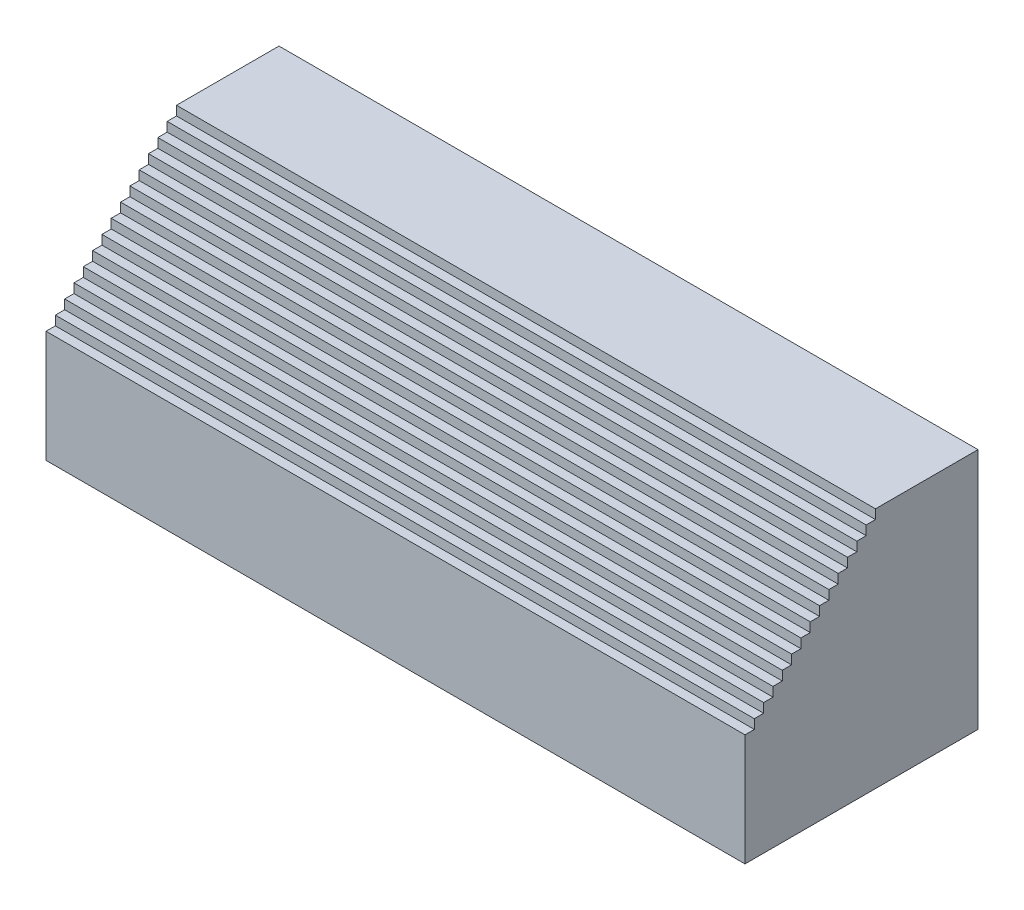
ISO-10303-21;
HEADER;
FILE_DESCRIPTION(('STEP AP214'),'2;1');
FILE_NAME('part.step','',(''),(''),'','','');
FILE_SCHEMA(('AUTOMOTIVE_DESIGN { 1 0 10303 214 1 1 1 1 }'));
ENDSEC;
DATA;
#1=APPLICATION_CONTEXT('core data for automotive mechanical design processes');
#2=APPLICATION_PROTOCOL_DEFINITION('international standard','automotive_design',2000,#1);
#3=PRODUCT_CONTEXT('',#1,'mechanical');
#4=PRODUCT('Part','Part','',(#3));
#5=PRODUCT_RELATED_PRODUCT_CATEGORY('part','',(#4));
#6=PRODUCT_DEFINITION_FORMATION('','',#4);
#7=PRODUCT_DEFINITION_CONTEXT('part definition',#1,'design');
#8=PRODUCT_DEFINITION('design','',#6,#7);
#9=PRODUCT_DEFINITION_SHAPE('','',#8);
#10=(LENGTH_UNIT() NAMED_UNIT(*) SI_UNIT(.MILLI.,.METRE.));
#11=(NAMED_UNIT(*) PLANE_ANGLE_UNIT() SI_UNIT($,.RADIAN.));
#12=(NAMED_UNIT(*) SI_UNIT($,.STERADIAN.) SOLID_ANGLE_UNIT());
#13=UNCERTAINTY_MEASURE_WITH_UNIT(LENGTH_MEASURE(1.E-05),#10,'distance_accuracy_value','');
#14=(GEOMETRIC_REPRESENTATION_CONTEXT(3) GLOBAL_UNCERTAINTY_ASSIGNED_CONTEXT((#13)) GLOBAL_UNIT_ASSIGNED_CONTEXT((#10,
#11,#12)) REPRESENTATION_CONTEXT('',''));
#15=CARTESIAN_POINT('',(0.,0.,0.));
#16=DIRECTION('',(0.,0.,1.));
#17=DIRECTION('',(1.,0.,0.));
#18=AXIS2_PLACEMENT_3D('',#15,#16,#17);
#19=CARTESIAN_POINT('',(-7.5,5.2,-2.5));
#20=DIRECTION('',(1.,0.,0.));
#21=DIRECTION('',(0.,0.,-1.));
#22=AXIS2_PLACEMENT_3D('',#19,#20,#21);
#23=PLANE('',#22);
#24=DIRECTION('',(0.,0.,-1.));
#25=VECTOR('',#24,1.);
#26=CARTESIAN_POINT('',(-7.5,5.,-0.100331192697603));
#27=LINE('',#26,#25);
#28=CARTESIAN_POINT('',(-7.5,5.,-0.100331192697603));
#29=VERTEX_POINT('',#28);
#30=CARTESIAN_POINT('',(-7.5,5.,-0.300331192697603));
#31=VERTEX_POINT('',#30);
#32=EDGE_CURVE('E300',#29,#31,#27,.T.);
#33=ORIENTED_EDGE('',*,*,#32,.T.);
#34=DIRECTION('',(0.,1.,0.));
#35=VECTOR('',#34,1.);
#36=CARTESIAN_POINT('',(-7.5,5.,-0.300331192697603));
#37=LINE('',#36,#35);
#38=CARTESIAN_POINT('',(-7.5,5.2,-0.300331192697603));
#39=VERTEX_POINT('',#38);
#40=EDGE_CURVE('E368',#31,#39,#37,.T.);
#41=ORIENTED_EDGE('',*,*,#40,.T.);
#42=DIRECTION('',(0.,0.,1.));
#43=VECTOR('',#42,1.);
#44=CARTESIAN_POINT('',(-7.5,5.2,-2.5));
#45=LINE('',#44,#43);
#46=CARTESIAN_POINT('',(-7.5,5.2,-2.5));
#47=VERTEX_POINT('',#46);
#48=EDGE_CURVE('E86',#47,#39,#45,.T.);
#49=ORIENTED_EDGE('',*,*,#48,.F.);
#50=DIRECTION('',(0.,-1.,0.));
#51=VECTOR('',#50,1.);
#52=CARTESIAN_POINT('',(-7.5,5.2,-2.5));
#53=LINE('',#52,#51);
#54=CARTESIAN_POINT('',(-7.5,0.,-2.5));
#55=VERTEX_POINT('',#54);
#56=EDGE_CURVE('E79',#47,#55,#53,.T.);
#57=ORIENTED_EDGE('',*,*,#56,.T.);
#58=DIRECTION('',(0.,0.,1.));
#59=VECTOR('',#58,1.);
#60=CARTESIAN_POINT('',(-7.5,0.,-2.5));
#61=LINE('',#60,#59);
#62=CARTESIAN_POINT('',(-7.5,0.,2.5));
#63=VERTEX_POINT('',#62);
#64=EDGE_CURVE('E93',#55,#63,#61,.T.);
#65=ORIENTED_EDGE('',*,*,#64,.T.);
#66=DIRECTION('',(0.,-1.,0.));
#67=VECTOR('',#66,1.);
#68=CARTESIAN_POINT('',(-7.5,5.2,2.5));
#69=LINE('',#68,#67);
#70=CARTESIAN_POINT('',(-7.5,2.4,2.5));
#71=VERTEX_POINT('',#70);
#72=EDGE_CURVE('E11',#71,#63,#69,.T.);
#73=ORIENTED_EDGE('',*,*,#72,.F.);
#74=DIRECTION('',(0.,0.,-1.));
#75=VECTOR('',#74,1.);
#76=CARTESIAN_POINT('',(-7.5,2.4,2.5));
#77=LINE('',#76,#75);
#78=CARTESIAN_POINT('',(-7.5,2.4,2.3));
#79=VERTEX_POINT('',#78);
#80=EDGE_CURVE('E128',#71,#79,#77,.T.);
#81=ORIENTED_EDGE('',*,*,#80,.T.);
#82=DIRECTION('',(0.,1.,0.));
#83=VECTOR('',#82,1.);
#84=CARTESIAN_POINT('',(-7.5,2.4,2.3));
#85=LINE('',#84,#83);
#86=CARTESIAN_POINT('',(-7.5,2.6,2.3));
#87=VERTEX_POINT('',#86);
#88=EDGE_CURVE('E578',#79,#87,#85,.T.);
#89=ORIENTED_EDGE('',*,*,#88,.T.);
#90=DIRECTION('',(0.,0.,-1.));
#91=VECTOR('',#90,1.);
#92=CARTESIAN_POINT('',(-7.5,2.6,2.3));
#93=LINE('',#92,#91);
#94=CARTESIAN_POINT('',(-7.5,2.6,2.1));
#95=VERTEX_POINT('',#94);
#96=EDGE_CURVE('E574',#87,#95,#93,.T.);
#97=ORIENTED_EDGE('',*,*,#96,.T.);
#98=DIRECTION('',(0.,1.,0.));
#99=VECTOR('',#98,1.);
#100=CARTESIAN_POINT('',(-7.5,2.6,2.1));
#101=LINE('',#100,#99);
#102=CARTESIAN_POINT('',(-7.5,2.8,2.1));
#103=VERTEX_POINT('',#102);
#104=EDGE_CURVE('E851',#95,#103,#101,.T.);
#105=ORIENTED_EDGE('',*,*,#104,.T.);
#106=DIRECTION('',(0.,0.,-1.));
#107=VECTOR('',#106,1.);
#108=CARTESIAN_POINT('',(-7.5,2.8,2.1));
#109=LINE('',#108,#107);
#110=CARTESIAN_POINT('',(-7.5,2.8,1.9));
#111=VERTEX_POINT('',#110);
#112=EDGE_CURVE('E564',#103,#111,#109,.T.);
#113=ORIENTED_EDGE('',*,*,#112,.T.);
#114=DIRECTION('',(0.,1.,0.));
#115=VECTOR('',#114,1.);
#116=CARTESIAN_POINT('',(-7.5,2.8,1.9));
#117=LINE('',#116,#115);
#118=CARTESIAN_POINT('',(-7.5,3.,1.9));
#119=VERTEX_POINT('',#118);
#120=EDGE_CURVE('E559',#111,#119,#117,.T.);
#121=ORIENTED_EDGE('',*,*,#120,.T.);
#122=DIRECTION('',(0.,0.,-1.));
#123=VECTOR('',#122,1.);
#124=CARTESIAN_POINT('',(-7.5,3.,1.9));
#125=LINE('',#124,#123);
#126=CARTESIAN_POINT('',(-7.5,3.,1.7));
#127=VERTEX_POINT('',#126);
#128=EDGE_CURVE('E858',#119,#127,#125,.T.);
#129=ORIENTED_EDGE('',*,*,#128,.T.);
#130=DIRECTION('',(0.,1.,0.));
#131=VECTOR('',#130,1.);
#132=CARTESIAN_POINT('',(-7.5,3.,1.7));
#133=LINE('',#132,#131);
#134=CARTESIAN_POINT('',(-7.5,3.2,1.7));
#135=VERTEX_POINT('',#134);
#136=EDGE_CURVE('E547',#127,#135,#133,.T.);
#137=ORIENTED_EDGE('',*,*,#136,.T.);
#138=DIRECTION('',(0.,0.,-1.));
#139=VECTOR('',#138,1.);
#140=CARTESIAN_POINT('',(-7.5,3.2,1.7));
#141=LINE('',#140,#139);
#142=CARTESIAN_POINT('',(-7.5,3.2,1.5));
#143=VERTEX_POINT('',#142);
#144=EDGE_CURVE('E542',#135,#143,#141,.T.);
#145=ORIENTED_EDGE('',*,*,#144,.T.);
#146=DIRECTION('',(0.,1.,0.));
#147=VECTOR('',#146,1.);
#148=CARTESIAN_POINT('',(-7.5,3.2,1.5));
#149=LINE('',#148,#147);
#150=CARTESIAN_POINT('',(-7.5,3.4,1.5));
#151=VERTEX_POINT('',#150);
#152=EDGE_CURVE('E862',#143,#151,#149,.T.);
#153=ORIENTED_EDGE('',*,*,#152,.T.);
#154=DIRECTION('',(0.,0.,-1.));
#155=VECTOR('',#154,1.);
#156=CARTESIAN_POINT('',(-7.5,3.4,1.5));
#157=LINE('',#156,#155);
#158=CARTESIAN_POINT('',(-7.5,3.4,1.3));
#159=VERTEX_POINT('',#158);
#160=EDGE_CURVE('E530',#151,#159,#157,.T.);
#161=ORIENTED_EDGE('',*,*,#160,.T.);
#162=DIRECTION('',(0.,1.,0.));
#163=VECTOR('',#162,1.);
#164=CARTESIAN_POINT('',(-7.5,3.4,1.3));
#165=LINE('',#164,#163);
#166=CARTESIAN_POINT('',(-7.5,3.6,1.3));
#167=VERTEX_POINT('',#166);
#168=EDGE_CURVE('E525',#159,#167,#165,.T.);
#169=ORIENTED_EDGE('',*,*,#168,.T.);
#170=DIRECTION('',(0.,0.,-1.));
#171=VECTOR('',#170,1.);
#172=CARTESIAN_POINT('',(-7.5,3.6,1.3));
#173=LINE('',#172,#171);
#174=CARTESIAN_POINT('',(-7.5,3.6,1.1));
#175=VERTEX_POINT('',#174);
#176=EDGE_CURVE('E866',#167,#175,#173,.T.);
#177=ORIENTED_EDGE('',*,*,#176,.T.);
#178=DIRECTION('',(0.,1.,0.));
#179=VECTOR('',#178,1.);
#180=CARTESIAN_POINT('',(-7.5,3.6,1.1));
#181=LINE('',#180,#179);
#182=CARTESIAN_POINT('',(-7.5,3.8,1.1));
#183=VERTEX_POINT('',#182);
#184=EDGE_CURVE('E513',#175,#183,#181,.T.);
#185=ORIENTED_EDGE('',*,*,#184,.T.);
#186=DIRECTION('',(0.,0.,-1.));
#187=VECTOR('',#186,1.);
#188=CARTESIAN_POINT('',(-7.5,3.8,1.1));
#189=LINE('',#188,#187);
#190=CARTESIAN_POINT('',(-7.5,3.8,0.900000000000002));
#191=VERTEX_POINT('',#190);
#192=EDGE_CURVE('E508',#183,#191,#189,.T.);
#193=ORIENTED_EDGE('',*,*,#192,.T.);
#194=DIRECTION('',(0.,1.,0.));
#195=VECTOR('',#194,1.);
#196=CARTESIAN_POINT('',(-7.5,3.8,0.900000000000002));
#197=LINE('',#196,#195);
#198=CARTESIAN_POINT('',(-7.5,4.,0.900000000000002));
#199=VERTEX_POINT('',#198);
#200=EDGE_CURVE('E870',#191,#199,#197,.T.);
#201=ORIENTED_EDGE('',*,*,#200,.T.);
#202=DIRECTION('',(0.,0.,-1.));
#203=VECTOR('',#202,1.);
#204=CARTESIAN_POINT('',(-7.5,4.,0.900000000000002));
#205=LINE('',#204,#203);
#206=CARTESIAN_POINT('',(-7.5,4.,0.700000000000002));
#207=VERTEX_POINT('',#206);
#208=EDGE_CURVE('E496',#199,#207,#205,.T.);
#209=ORIENTED_EDGE('',*,*,#208,.T.);
#210=DIRECTION('',(0.,1.,0.));
#211=VECTOR('',#210,1.);
#212=CARTESIAN_POINT('',(-7.5,4.,0.700000000000002));
#213=LINE('',#212,#211);
#214=CARTESIAN_POINT('',(-7.5,4.2,0.700000000000002));
#215=VERTEX_POINT('',#214);
#216=EDGE_CURVE('E491',#207,#215,#213,.T.);
#217=ORIENTED_EDGE('',*,*,#216,.T.);
#218=DIRECTION('',(0.,0.,-1.));
#219=VECTOR('',#218,1.);
#220=CARTESIAN_POINT('',(-7.5,4.2,0.700000000000002));
#221=LINE('',#220,#219);
#222=CARTESIAN_POINT('',(-7.5,4.2,0.500000000000002));
#223=VERTEX_POINT('',#222);
#224=EDGE_CURVE('E874',#215,#223,#221,.T.);
#225=ORIENTED_EDGE('',*,*,#224,.T.);
#226=DIRECTION('',(0.,1.,0.));
#227=VECTOR('',#226,1.);
#228=CARTESIAN_POINT('',(-7.5,4.2,0.500000000000002));
#229=LINE('',#228,#227);
#230=CARTESIAN_POINT('',(-7.5,4.4,0.500000000000002));
#231=VERTEX_POINT('',#230);
#232=EDGE_CURVE('E479',#223,#231,#229,.T.);
#233=ORIENTED_EDGE('',*,*,#232,.T.);
#234=DIRECTION('',(0.,0.,-1.));
#235=VECTOR('',#234,1.);
#236=CARTESIAN_POINT('',(-7.5,4.4,0.500000000000002));
#237=LINE('',#236,#235);
#238=CARTESIAN_POINT('',(-7.5,4.4,0.300000000000002));
#239=VERTEX_POINT('',#238);
#240=EDGE_CURVE('E474',#231,#239,#237,.T.);
#241=ORIENTED_EDGE('',*,*,#240,.T.);
#242=DIRECTION('',(0.,1.,0.));
#243=VECTOR('',#242,1.);
#244=CARTESIAN_POINT('',(-7.5,4.4,0.300000000000002));
#245=LINE('',#244,#243);
#246=CARTESIAN_POINT('',(-7.5,4.6,0.300000000000002));
#247=VERTEX_POINT('',#246);
#248=EDGE_CURVE('E878',#239,#247,#245,.T.);
#249=ORIENTED_EDGE('',*,*,#248,.T.);
#250=DIRECTION('',(0.,0.,-1.));
#251=VECTOR('',#250,1.);
#252=CARTESIAN_POINT('',(-7.5,4.6,0.300000000000002));
#253=LINE('',#252,#251);
#254=CARTESIAN_POINT('',(-7.5,4.6,0.100000000000002));
#255=VERTEX_POINT('',#254);
#256=EDGE_CURVE('E462',#247,#255,#253,.T.);
#257=ORIENTED_EDGE('',*,*,#256,.T.);
#258=DIRECTION('',(0.,1.,0.));
#259=VECTOR('',#258,1.);
#260=CARTESIAN_POINT('',(-7.5,4.6,0.100000000000002));
#261=LINE('',#260,#259);
#262=CARTESIAN_POINT('',(-7.5,4.8,0.100000000000002));
#263=VERTEX_POINT('',#262);
#264=EDGE_CURVE('E457',#255,#263,#261,.T.);
#265=ORIENTED_EDGE('',*,*,#264,.T.);
#266=DIRECTION('',(0.,0.,-1.));
#267=VECTOR('',#266,1.);
#268=CARTESIAN_POINT('',(-7.5,4.8,0.100000000000002));
#269=LINE('',#268,#267);
#270=CARTESIAN_POINT('',(-7.5,4.8,-0.100331192697603));
#271=VERTEX_POINT('',#270);
#272=EDGE_CURVE('E882',#263,#271,#269,.T.);
#273=ORIENTED_EDGE('',*,*,#272,.T.);
#274=DIRECTION('',(0.,1.,0.));
#275=VECTOR('',#274,1.);
#276=CARTESIAN_POINT('',(-7.5,4.8,-0.100331192697603));
#277=LINE('',#276,#275);
#278=EDGE_CURVE('E374',#271,#29,#277,.T.);
#279=ORIENTED_EDGE('',*,*,#278,.T.);
#280=EDGE_LOOP('',(#33,#41,#49,#57,#65,#73,#81,#89,#97,#105,#113,#121,#129,#137,#145,#153,#161,
#169,#177,#185,#193,#201,#209,#217,#225,#233,#241,#249,#257,#265,#273,#279));
#281=FACE_BOUND('',#280,.T.);
#282=ADVANCED_FACE('F35',(#281),#23,.F.);
#283=CARTESIAN_POINT('',(-7.5,5.2,2.5));
#284=DIRECTION('',(0.,0.,-1.));
#285=DIRECTION('',(-1.,0.,0.));
#286=AXIS2_PLACEMENT_3D('',#283,#284,#285);
#287=PLANE('',#286);
#288=DIRECTION('',(0.,-1.,0.));
#289=VECTOR('',#288,1.);
#290=CARTESIAN_POINT('',(7.5,5.2,2.5));
#291=LINE('',#290,#289);
#292=CARTESIAN_POINT('',(7.5,2.4,2.5));
#293=VERTEX_POINT('',#292);
#294=CARTESIAN_POINT('',(7.5,0.,2.5));
#295=VERTEX_POINT('',#294);
#296=EDGE_CURVE('E42',#293,#295,#291,.T.);
#297=ORIENTED_EDGE('',*,*,#296,.F.);
#298=DIRECTION('',(1.,0.,0.));
#299=VECTOR('',#298,1.);
#300=CARTESIAN_POINT('',(-7.5,2.4,2.5));
#301=LINE('',#300,#299);
#302=EDGE_CURVE('E123',#71,#293,#301,.T.);
#303=ORIENTED_EDGE('',*,*,#302,.F.);
#304=ORIENTED_EDGE('',*,*,#72,.T.);
#305=DIRECTION('',(1.,0.,0.));
#306=VECTOR('',#305,1.);
#307=CARTESIAN_POINT('',(-7.5,0.,2.5));
#308=LINE('',#307,#306);
#309=EDGE_CURVE('E99',#63,#295,#308,.T.);
#310=ORIENTED_EDGE('',*,*,#309,.T.);
#311=EDGE_LOOP('',(#297,#303,#304,#310));
#312=FACE_BOUND('',#311,.T.);
#313=ADVANCED_FACE('F120',(#312),#287,.F.);
#314=CARTESIAN_POINT('',(7.5,5.2,-2.5));
#315=DIRECTION('',(-1.,0.,0.));
#316=DIRECTION('',(0.,0.,1.));
#317=AXIS2_PLACEMENT_3D('',#314,#315,#316);
#318=PLANE('',#317);
#319=DIRECTION('',(0.,0.,-1.));
#320=VECTOR('',#319,1.);
#321=CARTESIAN_POINT('',(7.5,5.2,-2.5));
#322=LINE('',#321,#320);
#323=CARTESIAN_POINT('',(7.5,5.2,-0.300331192697606));
#324=VERTEX_POINT('',#323);
#325=CARTESIAN_POINT('',(7.5,5.2,-2.5));
#326=VERTEX_POINT('',#325);
#327=EDGE_CURVE('E369',#324,#326,#322,.T.);
#328=ORIENTED_EDGE('',*,*,#327,.F.);
#329=DIRECTION('',(0.,1.,0.));
#330=VECTOR('',#329,1.);
#331=CARTESIAN_POINT('',(7.5,5.,-0.300331192697606));
#332=LINE('',#331,#330);
#333=CARTESIAN_POINT('',(7.5,5.,-0.300331192697606));
#334=VERTEX_POINT('',#333);
#335=EDGE_CURVE('E49',#334,#324,#332,.T.);
#336=ORIENTED_EDGE('',*,*,#335,.F.);
#337=DIRECTION('',(0.,0.,-1.));
#338=VECTOR('',#337,1.);
#339=CARTESIAN_POINT('',(7.5,5.,-0.100331192697606));
#340=LINE('',#339,#338);
#341=CARTESIAN_POINT('',(7.5,5.,-0.100331192697606));
#342=VERTEX_POINT('',#341);
#343=EDGE_CURVE('E299',#342,#334,#340,.T.);
#344=ORIENTED_EDGE('',*,*,#343,.F.);
#345=DIRECTION('',(0.,1.,0.));
#346=VECTOR('',#345,1.);
#347=CARTESIAN_POINT('',(7.5,4.8,-0.100331192697606));
#348=LINE('',#347,#346);
#349=CARTESIAN_POINT('',(7.5,4.8,-0.100331192697606));
#350=VERTEX_POINT('',#349);
#351=EDGE_CURVE('E307',#350,#342,#348,.T.);
#352=ORIENTED_EDGE('',*,*,#351,.F.);
#353=DIRECTION('',(0.,0.,-1.));
#354=VECTOR('',#353,1.);
#355=CARTESIAN_POINT('',(7.5,4.8,0.0999999999999995));
#356=LINE('',#355,#354);
#357=CARTESIAN_POINT('',(7.5,4.8,0.0999999999999995));
#358=VERTEX_POINT('',#357);
#359=EDGE_CURVE('E311',#358,#350,#356,.T.);
#360=ORIENTED_EDGE('',*,*,#359,.F.);
#361=DIRECTION('',(0.,1.,0.));
#362=VECTOR('',#361,1.);
#363=CARTESIAN_POINT('',(7.5,4.6,0.0999999999999995));
#364=LINE('',#363,#362);
#365=CARTESIAN_POINT('',(7.5,4.6,0.0999999999999995));
#366=VERTEX_POINT('',#365);
#367=EDGE_CURVE('E445',#366,#358,#364,.T.);
#368=ORIENTED_EDGE('',*,*,#367,.F.);
#369=DIRECTION('',(0.,0.,-1.));
#370=VECTOR('',#369,1.);
#371=CARTESIAN_POINT('',(7.5,4.6,0.299999999999999));
#372=LINE('',#371,#370);
#373=CARTESIAN_POINT('',(7.5,4.6,0.299999999999999));
#374=VERTEX_POINT('',#373);
#375=EDGE_CURVE('E442',#374,#366,#372,.T.);
#376=ORIENTED_EDGE('',*,*,#375,.F.);
#377=DIRECTION('',(0.,1.,0.));
#378=VECTOR('',#377,1.);
#379=CARTESIAN_POINT('',(7.5,4.4,0.299999999999999));
#380=LINE('',#379,#378);
#381=CARTESIAN_POINT('',(7.5,4.4,0.299999999999999));
#382=VERTEX_POINT('',#381);
#383=EDGE_CURVE('E439',#382,#374,#380,.T.);
#384=ORIENTED_EDGE('',*,*,#383,.F.);
#385=DIRECTION('',(0.,0.,-1.));
#386=VECTOR('',#385,1.);
#387=CARTESIAN_POINT('',(7.5,4.4,0.499999999999999));
#388=LINE('',#387,#386);
#389=CARTESIAN_POINT('',(7.5,4.4,0.499999999999999));
#390=VERTEX_POINT('',#389);
#391=EDGE_CURVE('E436',#390,#382,#388,.T.);
#392=ORIENTED_EDGE('',*,*,#391,.F.);
#393=DIRECTION('',(0.,1.,0.));
#394=VECTOR('',#393,1.);
#395=CARTESIAN_POINT('',(7.5,4.2,0.499999999999999));
#396=LINE('',#395,#394);
#397=CARTESIAN_POINT('',(7.5,4.2,0.499999999999999));
#398=VERTEX_POINT('',#397);
#399=EDGE_CURVE('E433',#398,#390,#396,.T.);
#400=ORIENTED_EDGE('',*,*,#399,.F.);
#401=DIRECTION('',(0.,0.,-1.));
#402=VECTOR('',#401,1.);
#403=CARTESIAN_POINT('',(7.5,4.2,0.699999999999999));
#404=LINE('',#403,#402);
#405=CARTESIAN_POINT('',(7.5,4.2,0.699999999999999));
#406=VERTEX_POINT('',#405);
#407=EDGE_CURVE('E430',#406,#398,#404,.T.);
#408=ORIENTED_EDGE('',*,*,#407,.F.);
#409=DIRECTION('',(0.,1.,0.));
#410=VECTOR('',#409,1.);
#411=CARTESIAN_POINT('',(7.5,4.,0.699999999999999));
#412=LINE('',#411,#410);
#413=CARTESIAN_POINT('',(7.5,4.,0.699999999999999));
#414=VERTEX_POINT('',#413);
#415=EDGE_CURVE('E427',#414,#406,#412,.T.);
#416=ORIENTED_EDGE('',*,*,#415,.F.);
#417=DIRECTION('',(0.,0.,-1.));
#418=VECTOR('',#417,1.);
#419=CARTESIAN_POINT('',(7.5,4.,0.899999999999999));
#420=LINE('',#419,#418);
#421=CARTESIAN_POINT('',(7.5,4.,0.899999999999999));
#422=VERTEX_POINT('',#421);
#423=EDGE_CURVE('E424',#422,#414,#420,.T.);
#424=ORIENTED_EDGE('',*,*,#423,.F.);
#425=DIRECTION('',(0.,1.,0.));
#426=VECTOR('',#425,1.);
#427=CARTESIAN_POINT('',(7.5,3.8,0.899999999999999));
#428=LINE('',#427,#426);
#429=CARTESIAN_POINT('',(7.5,3.8,0.899999999999999));
#430=VERTEX_POINT('',#429);
#431=EDGE_CURVE('E421',#430,#422,#428,.T.);
#432=ORIENTED_EDGE('',*,*,#431,.F.);
#433=DIRECTION('',(0.,0.,-1.));
#434=VECTOR('',#433,1.);
#435=CARTESIAN_POINT('',(7.5,3.8,1.1));
#436=LINE('',#435,#434);
#437=CARTESIAN_POINT('',(7.5,3.8,1.1));
#438=VERTEX_POINT('',#437);
#439=EDGE_CURVE('E418',#438,#430,#436,.T.);
#440=ORIENTED_EDGE('',*,*,#439,.F.);
#441=DIRECTION('',(0.,1.,0.));
#442=VECTOR('',#441,1.);
#443=CARTESIAN_POINT('',(7.5,3.6,1.1));
#444=LINE('',#443,#442);
#445=CARTESIAN_POINT('',(7.5,3.6,1.1));
#446=VERTEX_POINT('',#445);
#447=EDGE_CURVE('E415',#446,#438,#444,.T.);
#448=ORIENTED_EDGE('',*,*,#447,.F.);
#449=DIRECTION('',(0.,0.,-1.));
#450=VECTOR('',#449,1.);
#451=CARTESIAN_POINT('',(7.5,3.6,1.3));
#452=LINE('',#451,#450);
#453=CARTESIAN_POINT('',(7.5,3.6,1.3));
#454=VERTEX_POINT('',#453);
#455=EDGE_CURVE('E412',#454,#446,#452,.T.);
#456=ORIENTED_EDGE('',*,*,#455,.F.);
#457=DIRECTION('',(0.,1.,0.));
#458=VECTOR('',#457,1.);
#459=CARTESIAN_POINT('',(7.5,3.4,1.3));
#460=LINE('',#459,#458);
#461=CARTESIAN_POINT('',(7.5,3.4,1.3));
#462=VERTEX_POINT('',#461);
#463=EDGE_CURVE('E409',#462,#454,#460,.T.);
#464=ORIENTED_EDGE('',*,*,#463,.F.);
#465=DIRECTION('',(0.,0.,-1.));
#466=VECTOR('',#465,1.);
#467=CARTESIAN_POINT('',(7.5,3.4,1.5));
#468=LINE('',#467,#466);
#469=CARTESIAN_POINT('',(7.5,3.4,1.5));
#470=VERTEX_POINT('',#469);
#471=EDGE_CURVE('E406',#470,#462,#468,.T.);
#472=ORIENTED_EDGE('',*,*,#471,.F.);
#473=DIRECTION('',(0.,1.,0.));
#474=VECTOR('',#473,1.);
#475=CARTESIAN_POINT('',(7.5,3.2,1.5));
#476=LINE('',#475,#474);
#477=CARTESIAN_POINT('',(7.5,3.2,1.5));
#478=VERTEX_POINT('',#477);
#479=EDGE_CURVE('E403',#478,#470,#476,.T.);
#480=ORIENTED_EDGE('',*,*,#479,.F.);
#481=DIRECTION('',(0.,0.,-1.));
#482=VECTOR('',#481,1.);
#483=CARTESIAN_POINT('',(7.5,3.2,1.7));
#484=LINE('',#483,#482);
#485=CARTESIAN_POINT('',(7.5,3.2,1.7));
#486=VERTEX_POINT('',#485);
#487=EDGE_CURVE('E400',#486,#478,#484,.T.);
#488=ORIENTED_EDGE('',*,*,#487,.F.);
#489=DIRECTION('',(0.,1.,0.));
#490=VECTOR('',#489,1.);
#491=CARTESIAN_POINT('',(7.5,3.,1.7));
#492=LINE('',#491,#490);
#493=CARTESIAN_POINT('',(7.5,3.,1.7));
#494=VERTEX_POINT('',#493);
#495=EDGE_CURVE('E397',#494,#486,#492,.T.);
#496=ORIENTED_EDGE('',*,*,#495,.F.);
#497=DIRECTION('',(0.,0.,-1.));
#498=VECTOR('',#497,1.);
#499=CARTESIAN_POINT('',(7.5,3.,1.9));
#500=LINE('',#499,#498);
#501=CARTESIAN_POINT('',(7.5,3.,1.9));
#502=VERTEX_POINT('',#501);
#503=EDGE_CURVE('E394',#502,#494,#500,.T.);
#504=ORIENTED_EDGE('',*,*,#503,.F.);
#505=DIRECTION('',(0.,1.,0.));
#506=VECTOR('',#505,1.);
#507=CARTESIAN_POINT('',(7.5,2.8,1.9));
#508=LINE('',#507,#506);
#509=CARTESIAN_POINT('',(7.5,2.8,1.9));
#510=VERTEX_POINT('',#509);
#511=EDGE_CURVE('E391',#510,#502,#508,.T.);
#512=ORIENTED_EDGE('',*,*,#511,.F.);
#513=DIRECTION('',(0.,0.,-1.));
#514=VECTOR('',#513,1.);
#515=CARTESIAN_POINT('',(7.5,2.8,2.1));
#516=LINE('',#515,#514);
#517=CARTESIAN_POINT('',(7.5,2.8,2.1));
#518=VERTEX_POINT('',#517);
#519=EDGE_CURVE('E388',#518,#510,#516,.T.);
#520=ORIENTED_EDGE('',*,*,#519,.F.);
#521=DIRECTION('',(0.,1.,0.));
#522=VECTOR('',#521,1.);
#523=CARTESIAN_POINT('',(7.5,2.6,2.1));
#524=LINE('',#523,#522);
#525=CARTESIAN_POINT('',(7.5,2.6,2.1));
#526=VERTEX_POINT('',#525);
#527=EDGE_CURVE('E385',#526,#518,#524,.T.);
#528=ORIENTED_EDGE('',*,*,#527,.F.);
#529=DIRECTION('',(0.,0.,-1.));
#530=VECTOR('',#529,1.);
#531=CARTESIAN_POINT('',(7.5,2.6,2.3));
#532=LINE('',#531,#530);
#533=CARTESIAN_POINT('',(7.5,2.6,2.3));
#534=VERTEX_POINT('',#533);
#535=EDGE_CURVE('E382',#534,#526,#532,.T.);
#536=ORIENTED_EDGE('',*,*,#535,.F.);
#537=DIRECTION('',(0.,1.,0.));
#538=VECTOR('',#537,1.);
#539=CARTESIAN_POINT('',(7.5,2.4,2.3));
#540=LINE('',#539,#538);
#541=CARTESIAN_POINT('',(7.5,2.4,2.3));
#542=VERTEX_POINT('',#541);
#543=EDGE_CURVE('E379',#542,#534,#540,.T.);
#544=ORIENTED_EDGE('',*,*,#543,.F.);
#545=DIRECTION('',(0.,0.,-1.));
#546=VECTOR('',#545,1.);
#547=CARTESIAN_POINT('',(7.5,2.4,2.5));
#548=LINE('',#547,#546);
#549=EDGE_CURVE('E117',#293,#542,#548,.T.);
#550=ORIENTED_EDGE('',*,*,#549,.F.);
#551=ORIENTED_EDGE('',*,*,#296,.T.);
#552=DIRECTION('',(0.,0.,-1.));
#553=VECTOR('',#552,1.);
#554=CARTESIAN_POINT('',(7.5,0.,-2.5));
#555=LINE('',#554,#553);
#556=CARTESIAN_POINT('',(7.5,0.,-2.5));
#557=VERTEX_POINT('',#556);
#558=EDGE_CURVE('E87',#295,#557,#555,.T.);
#559=ORIENTED_EDGE('',*,*,#558,.T.);
#560=DIRECTION('',(0.,-1.,0.));
#561=VECTOR('',#560,1.);
#562=CARTESIAN_POINT('',(7.5,5.2,-2.5));
#563=LINE('',#562,#561);
#564=EDGE_CURVE('E82',#326,#557,#563,.T.);
#565=ORIENTED_EDGE('',*,*,#564,.F.);
#566=EDGE_LOOP('',(#328,#336,#344,#352,#360,#368,#376,#384,#392,#400,#408,#416,#424,#432,#440,
#448,#456,#464,#472,#480,#488,#496,#504,#512,#520,#528,#536,#544,#550,#551,#559,#565));
#567=FACE_BOUND('',#566,.T.);
#568=ADVANCED_FACE('F113',(#567),#318,.F.);
#569=CARTESIAN_POINT('',(-7.5,5.2,-2.5));
#570=DIRECTION('',(0.,0.,1.));
#571=DIRECTION('',(1.,0.,0.));
#572=AXIS2_PLACEMENT_3D('',#569,#570,#571);
#573=PLANE('',#572);
#574=DIRECTION('',(-1.,0.,0.));
#575=VECTOR('',#574,1.);
#576=CARTESIAN_POINT('',(-7.5,0.,-2.5));
#577=LINE('',#576,#575);
#578=EDGE_CURVE('E76',#557,#55,#577,.T.);
#579=ORIENTED_EDGE('',*,*,#578,.T.);
#580=ORIENTED_EDGE('',*,*,#56,.F.);
#581=DIRECTION('',(-1.,0.,0.));
#582=VECTOR('',#581,1.);
#583=CARTESIAN_POINT('',(-7.5,5.2,-2.5));
#584=LINE('',#583,#582);
#585=EDGE_CURVE('E58',#326,#47,#584,.T.);
#586=ORIENTED_EDGE('',*,*,#585,.F.);
#587=ORIENTED_EDGE('',*,*,#564,.T.);
#588=EDGE_LOOP('',(#579,#580,#586,#587));
#589=FACE_BOUND('',#588,.T.);
#590=ADVANCED_FACE('F78',(#589),#573,.F.);
#591=CARTESIAN_POINT('',(0.,5.2,0.));
#592=DIRECTION('',(0.,1.,0.));
#593=DIRECTION('',(0.,0.,1.));
#594=AXIS2_PLACEMENT_3D('',#591,#592,#593);
#595=PLANE('',#594);
#596=DIRECTION('',(1.,0.,0.));
#597=VECTOR('',#596,1.);
#598=CARTESIAN_POINT('',(-7.5,5.2,-0.300331192697603));
#599=LINE('',#598,#597);
#600=EDGE_CURVE('E100',#39,#324,#599,.T.);
#601=ORIENTED_EDGE('',*,*,#600,.T.);
#602=ORIENTED_EDGE('',*,*,#327,.T.);
#603=ORIENTED_EDGE('',*,*,#585,.T.);
#604=ORIENTED_EDGE('',*,*,#48,.T.);
#605=EDGE_LOOP('',(#601,#602,#603,#604));
#606=FACE_BOUND('',#605,.T.);
#607=ADVANCED_FACE('F370',(#606),#595,.T.);
#608=CARTESIAN_POINT('',(0.,0.,0.));
#609=DIRECTION('',(0.,1.,0.));
#610=DIRECTION('',(0.,0.,1.));
#611=AXIS2_PLACEMENT_3D('',#608,#609,#610);
#612=PLANE('',#611);
#613=ORIENTED_EDGE('',*,*,#64,.F.);
#614=ORIENTED_EDGE('',*,*,#578,.F.);
#615=ORIENTED_EDGE('',*,*,#558,.F.);
#616=ORIENTED_EDGE('',*,*,#309,.F.);
#617=EDGE_LOOP('',(#613,#614,#615,#616));
#618=FACE_BOUND('',#617,.T.);
#619=ADVANCED_FACE('F97',(#618),#612,.F.);
#620=CARTESIAN_POINT('',(-7.5,5.,-0.300331192697603));
#621=DIRECTION('',(0.,0.,-1.));
#622=DIRECTION('',(-1.,0.,0.));
#623=AXIS2_PLACEMENT_3D('',#620,#621,#622);
#624=PLANE('',#623);
#625=ORIENTED_EDGE('',*,*,#335,.T.);
#626=ORIENTED_EDGE('',*,*,#600,.F.);
#627=ORIENTED_EDGE('',*,*,#40,.F.);
#628=DIRECTION('',(1.,0.,0.));
#629=VECTOR('',#628,1.);
#630=CARTESIAN_POINT('',(-7.5,5.,-0.300331192697603));
#631=LINE('',#630,#629);
#632=EDGE_CURVE('E103',#31,#334,#631,.T.);
#633=ORIENTED_EDGE('',*,*,#632,.T.);
#634=EDGE_LOOP('',(#625,#626,#627,#633));
#635=FACE_BOUND('',#634,.T.);
#636=ADVANCED_FACE('F372',(#635),#624,.F.);
#637=CARTESIAN_POINT('',(-7.5,5.,-0.100331192697603));
#638=DIRECTION('',(0.,-1.,0.));
#639=DIRECTION('',(0.,0.,-1.));
#640=AXIS2_PLACEMENT_3D('',#637,#638,#639);
#641=PLANE('',#640);
#642=ORIENTED_EDGE('',*,*,#343,.T.);
#643=ORIENTED_EDGE('',*,*,#632,.F.);
#644=ORIENTED_EDGE('',*,*,#32,.F.);
#645=DIRECTION('',(1.,0.,0.));
#646=VECTOR('',#645,1.);
#647=CARTESIAN_POINT('',(-7.5,5.,-0.100331192697603));
#648=LINE('',#647,#646);
#649=EDGE_CURVE('E295',#29,#342,#648,.T.);
#650=ORIENTED_EDGE('',*,*,#649,.T.);
#651=EDGE_LOOP('',(#642,#643,#644,#650));
#652=FACE_BOUND('',#651,.T.);
#653=ADVANCED_FACE('F297',(#652),#641,.F.);
#654=CARTESIAN_POINT('',(-7.5,4.8,-0.100331192697603));
#655=DIRECTION('',(0.,0.,-1.));
#656=DIRECTION('',(-1.,0.,0.));
#657=AXIS2_PLACEMENT_3D('',#654,#655,#656);
#658=PLANE('',#657);
#659=ORIENTED_EDGE('',*,*,#351,.T.);
#660=ORIENTED_EDGE('',*,*,#649,.F.);
#661=ORIENTED_EDGE('',*,*,#278,.F.);
#662=DIRECTION('',(1.,0.,0.));
#663=VECTOR('',#662,1.);
#664=CARTESIAN_POINT('',(-7.5,4.8,-0.100331192697603));
#665=LINE('',#664,#663);
#666=EDGE_CURVE('E304',#271,#350,#665,.T.);
#667=ORIENTED_EDGE('',*,*,#666,.T.);
#668=EDGE_LOOP('',(#659,#660,#661,#667));
#669=FACE_BOUND('',#668,.T.);
#670=ADVANCED_FACE('F308',(#669),#658,.F.);
#671=CARTESIAN_POINT('',(-7.5,4.8,0.100000000000002));
#672=DIRECTION('',(0.,-1.,0.));
#673=DIRECTION('',(0.,0.,-1.));
#674=AXIS2_PLACEMENT_3D('',#671,#672,#673);
#675=PLANE('',#674);
#676=ORIENTED_EDGE('',*,*,#359,.T.);
#677=ORIENTED_EDGE('',*,*,#666,.F.);
#678=ORIENTED_EDGE('',*,*,#272,.F.);
#679=DIRECTION('',(1.,0.,0.));
#680=VECTOR('',#679,1.);
#681=CARTESIAN_POINT('',(-7.5,4.8,0.100000000000002));
#682=LINE('',#681,#680);
#683=EDGE_CURVE('E319',#263,#358,#682,.T.);
#684=ORIENTED_EDGE('',*,*,#683,.T.);
#685=EDGE_LOOP('',(#676,#677,#678,#684));
#686=FACE_BOUND('',#685,.T.);
#687=ADVANCED_FACE('F448',(#686),#675,.F.);
#688=CARTESIAN_POINT('',(-7.5,4.6,0.100000000000002));
#689=DIRECTION('',(0.,0.,-1.));
#690=DIRECTION('',(-1.,0.,0.));
#691=AXIS2_PLACEMENT_3D('',#688,#689,#690);
#692=PLANE('',#691);
#693=ORIENTED_EDGE('',*,*,#367,.T.);
#694=ORIENTED_EDGE('',*,*,#683,.F.);
#695=ORIENTED_EDGE('',*,*,#264,.F.);
#696=DIRECTION('',(1.,0.,0.));
#697=VECTOR('',#696,1.);
#698=CARTESIAN_POINT('',(-7.5,4.6,0.100000000000002));
#699=LINE('',#698,#697);
#700=EDGE_CURVE('E321',#255,#366,#699,.T.);
#701=ORIENTED_EDGE('',*,*,#700,.T.);
#702=EDGE_LOOP('',(#693,#694,#695,#701));
#703=FACE_BOUND('',#702,.T.);
#704=ADVANCED_FACE('F454',(#703),#692,.F.);
#705=CARTESIAN_POINT('',(-7.5,4.6,0.300000000000002));
#706=DIRECTION('',(0.,-1.,0.));
#707=DIRECTION('',(0.,0.,-1.));
#708=AXIS2_PLACEMENT_3D('',#705,#706,#707);
#709=PLANE('',#708);
#710=ORIENTED_EDGE('',*,*,#375,.T.);
#711=ORIENTED_EDGE('',*,*,#700,.F.);
#712=ORIENTED_EDGE('',*,*,#256,.F.);
#713=DIRECTION('',(1.,0.,0.));
#714=VECTOR('',#713,1.);
#715=CARTESIAN_POINT('',(-7.5,4.6,0.300000000000002));
#716=LINE('',#715,#714);
#717=EDGE_CURVE('E323',#247,#374,#716,.T.);
#718=ORIENTED_EDGE('',*,*,#717,.T.);
#719=EDGE_LOOP('',(#710,#711,#712,#718));
#720=FACE_BOUND('',#719,.T.);
#721=ADVANCED_FACE('F461',(#720),#709,.F.);
#722=CARTESIAN_POINT('',(-7.5,4.4,0.300000000000002));
#723=DIRECTION('',(0.,0.,-1.));
#724=DIRECTION('',(-1.,0.,0.));
#725=AXIS2_PLACEMENT_3D('',#722,#723,#724);
#726=PLANE('',#725);
#727=ORIENTED_EDGE('',*,*,#383,.T.);
#728=ORIENTED_EDGE('',*,*,#717,.F.);
#729=ORIENTED_EDGE('',*,*,#248,.F.);
#730=DIRECTION('',(1.,0.,0.));
#731=VECTOR('',#730,1.);
#732=CARTESIAN_POINT('',(-7.5,4.4,0.300000000000002));
#733=LINE('',#732,#731);
#734=EDGE_CURVE('E325',#239,#382,#733,.T.);
#735=ORIENTED_EDGE('',*,*,#734,.T.);
#736=EDGE_LOOP('',(#727,#728,#729,#735));
#737=FACE_BOUND('',#736,.T.);
#738=ADVANCED_FACE('F466',(#737),#726,.F.);
#739=CARTESIAN_POINT('',(-7.5,4.4,0.500000000000002));
#740=DIRECTION('',(0.,-1.,0.));
#741=DIRECTION('',(0.,0.,-1.));
#742=AXIS2_PLACEMENT_3D('',#739,#740,#741);
#743=PLANE('',#742);
#744=ORIENTED_EDGE('',*,*,#391,.T.);
#745=ORIENTED_EDGE('',*,*,#734,.F.);
#746=ORIENTED_EDGE('',*,*,#240,.F.);
#747=DIRECTION('',(1.,0.,0.));
#748=VECTOR('',#747,1.);
#749=CARTESIAN_POINT('',(-7.5,4.4,0.500000000000002));
#750=LINE('',#749,#748);
#751=EDGE_CURVE('E327',#231,#390,#750,.T.);
#752=ORIENTED_EDGE('',*,*,#751,.T.);
#753=EDGE_LOOP('',(#744,#745,#746,#752));
#754=FACE_BOUND('',#753,.T.);
#755=ADVANCED_FACE('F471',(#754),#743,.F.);
#756=CARTESIAN_POINT('',(-7.5,4.2,0.500000000000002));
#757=DIRECTION('',(0.,0.,-1.));
#758=DIRECTION('',(-1.,0.,0.));
#759=AXIS2_PLACEMENT_3D('',#756,#757,#758);
#760=PLANE('',#759);
#761=ORIENTED_EDGE('',*,*,#399,.T.);
#762=ORIENTED_EDGE('',*,*,#751,.F.);
#763=ORIENTED_EDGE('',*,*,#232,.F.);
#764=DIRECTION('',(1.,0.,0.));
#765=VECTOR('',#764,1.);
#766=CARTESIAN_POINT('',(-7.5,4.2,0.500000000000002));
#767=LINE('',#766,#765);
#768=EDGE_CURVE('E329',#223,#398,#767,.T.);
#769=ORIENTED_EDGE('',*,*,#768,.T.);
#770=EDGE_LOOP('',(#761,#762,#763,#769));
#771=FACE_BOUND('',#770,.T.);
#772=ADVANCED_FACE('F478',(#771),#760,.F.);
#773=CARTESIAN_POINT('',(-7.5,4.2,0.700000000000002));
#774=DIRECTION('',(0.,-1.,0.));
#775=DIRECTION('',(0.,0.,-1.));
#776=AXIS2_PLACEMENT_3D('',#773,#774,#775);
#777=PLANE('',#776);
#778=ORIENTED_EDGE('',*,*,#407,.T.);
#779=ORIENTED_EDGE('',*,*,#768,.F.);
#780=ORIENTED_EDGE('',*,*,#224,.F.);
#781=DIRECTION('',(1.,0.,0.));
#782=VECTOR('',#781,1.);
#783=CARTESIAN_POINT('',(-7.5,4.2,0.700000000000002));
#784=LINE('',#783,#782);
#785=EDGE_CURVE('E331',#215,#406,#784,.T.);
#786=ORIENTED_EDGE('',*,*,#785,.T.);
#787=EDGE_LOOP('',(#778,#779,#780,#786));
#788=FACE_BOUND('',#787,.T.);
#789=ADVANCED_FACE('F483',(#788),#777,.F.);
#790=CARTESIAN_POINT('',(-7.5,4.,0.700000000000002));
#791=DIRECTION('',(0.,0.,-1.));
#792=DIRECTION('',(-1.,0.,0.));
#793=AXIS2_PLACEMENT_3D('',#790,#791,#792);
#794=PLANE('',#793);
#795=ORIENTED_EDGE('',*,*,#415,.T.);
#796=ORIENTED_EDGE('',*,*,#785,.F.);
#797=ORIENTED_EDGE('',*,*,#216,.F.);
#798=DIRECTION('',(1.,0.,0.));
#799=VECTOR('',#798,1.);
#800=CARTESIAN_POINT('',(-7.5,4.,0.700000000000002));
#801=LINE('',#800,#799);
#802=EDGE_CURVE('E333',#207,#414,#801,.T.);
#803=ORIENTED_EDGE('',*,*,#802,.T.);
#804=EDGE_LOOP('',(#795,#796,#797,#803));
#805=FACE_BOUND('',#804,.T.);
#806=ADVANCED_FACE('F488',(#805),#794,.F.);
#807=CARTESIAN_POINT('',(-7.5,4.,0.900000000000002));
#808=DIRECTION('',(0.,-1.,0.));
#809=DIRECTION('',(0.,0.,-1.));
#810=AXIS2_PLACEMENT_3D('',#807,#808,#809);
#811=PLANE('',#810);
#812=ORIENTED_EDGE('',*,*,#423,.T.);
#813=ORIENTED_EDGE('',*,*,#802,.F.);
#814=ORIENTED_EDGE('',*,*,#208,.F.);
#815=DIRECTION('',(1.,0.,0.));
#816=VECTOR('',#815,1.);
#817=CARTESIAN_POINT('',(-7.5,4.,0.900000000000002));
#818=LINE('',#817,#816);
#819=EDGE_CURVE('E335',#199,#422,#818,.T.);
#820=ORIENTED_EDGE('',*,*,#819,.T.);
#821=EDGE_LOOP('',(#812,#813,#814,#820));
#822=FACE_BOUND('',#821,.T.);
#823=ADVANCED_FACE('F495',(#822),#811,.F.);
#824=CARTESIAN_POINT('',(-7.5,3.8,0.900000000000002));
#825=DIRECTION('',(0.,0.,-1.));
#826=DIRECTION('',(-1.,0.,0.));
#827=AXIS2_PLACEMENT_3D('',#824,#825,#826);
#828=PLANE('',#827);
#829=ORIENTED_EDGE('',*,*,#431,.T.);
#830=ORIENTED_EDGE('',*,*,#819,.F.);
#831=ORIENTED_EDGE('',*,*,#200,.F.);
#832=DIRECTION('',(1.,0.,0.));
#833=VECTOR('',#832,1.);
#834=CARTESIAN_POINT('',(-7.5,3.8,0.900000000000002));
#835=LINE('',#834,#833);
#836=EDGE_CURVE('E337',#191,#430,#835,.T.);
#837=ORIENTED_EDGE('',*,*,#836,.T.);
#838=EDGE_LOOP('',(#829,#830,#831,#837));
#839=FACE_BOUND('',#838,.T.);
#840=ADVANCED_FACE('F500',(#839),#828,.F.);
#841=CARTESIAN_POINT('',(-7.5,3.8,1.1));
#842=DIRECTION('',(0.,-1.,0.));
#843=DIRECTION('',(0.,0.,-1.));
#844=AXIS2_PLACEMENT_3D('',#841,#842,#843);
#845=PLANE('',#844);
#846=ORIENTED_EDGE('',*,*,#439,.T.);
#847=ORIENTED_EDGE('',*,*,#836,.F.);
#848=ORIENTED_EDGE('',*,*,#192,.F.);
#849=DIRECTION('',(1.,0.,0.));
#850=VECTOR('',#849,1.);
#851=CARTESIAN_POINT('',(-7.5,3.8,1.1));
#852=LINE('',#851,#850);
#853=EDGE_CURVE('E339',#183,#438,#852,.T.);
#854=ORIENTED_EDGE('',*,*,#853,.T.);
#855=EDGE_LOOP('',(#846,#847,#848,#854));
#856=FACE_BOUND('',#855,.T.);
#857=ADVANCED_FACE('F505',(#856),#845,.F.);
#858=CARTESIAN_POINT('',(-7.5,3.6,1.1));
#859=DIRECTION('',(0.,0.,-1.));
#860=DIRECTION('',(-1.,0.,0.));
#861=AXIS2_PLACEMENT_3D('',#858,#859,#860);
#862=PLANE('',#861);
#863=ORIENTED_EDGE('',*,*,#447,.T.);
#864=ORIENTED_EDGE('',*,*,#853,.F.);
#865=ORIENTED_EDGE('',*,*,#184,.F.);
#866=DIRECTION('',(1.,0.,0.));
#867=VECTOR('',#866,1.);
#868=CARTESIAN_POINT('',(-7.5,3.6,1.1));
#869=LINE('',#868,#867);
#870=EDGE_CURVE('E341',#175,#446,#869,.T.);
#871=ORIENTED_EDGE('',*,*,#870,.T.);
#872=EDGE_LOOP('',(#863,#864,#865,#871));
#873=FACE_BOUND('',#872,.T.);
#874=ADVANCED_FACE('F512',(#873),#862,.F.);
#875=CARTESIAN_POINT('',(-7.5,3.6,1.3));
#876=DIRECTION('',(0.,-1.,0.));
#877=DIRECTION('',(0.,0.,-1.));
#878=AXIS2_PLACEMENT_3D('',#875,#876,#877);
#879=PLANE('',#878);
#880=ORIENTED_EDGE('',*,*,#455,.T.);
#881=ORIENTED_EDGE('',*,*,#870,.F.);
#882=ORIENTED_EDGE('',*,*,#176,.F.);
#883=DIRECTION('',(1.,0.,0.));
#884=VECTOR('',#883,1.);
#885=CARTESIAN_POINT('',(-7.5,3.6,1.3));
#886=LINE('',#885,#884);
#887=EDGE_CURVE('E343',#167,#454,#886,.T.);
#888=ORIENTED_EDGE('',*,*,#887,.T.);
#889=EDGE_LOOP('',(#880,#881,#882,#888));
#890=FACE_BOUND('',#889,.T.);
#891=ADVANCED_FACE('F517',(#890),#879,.F.);
#892=CARTESIAN_POINT('',(-7.5,3.4,1.3));
#893=DIRECTION('',(0.,0.,-1.));
#894=DIRECTION('',(-1.,0.,0.));
#895=AXIS2_PLACEMENT_3D('',#892,#893,#894);
#896=PLANE('',#895);
#897=ORIENTED_EDGE('',*,*,#463,.T.);
#898=ORIENTED_EDGE('',*,*,#887,.F.);
#899=ORIENTED_EDGE('',*,*,#168,.F.);
#900=DIRECTION('',(1.,0.,0.));
#901=VECTOR('',#900,1.);
#902=CARTESIAN_POINT('',(-7.5,3.4,1.3));
#903=LINE('',#902,#901);
#904=EDGE_CURVE('E345',#159,#462,#903,.T.);
#905=ORIENTED_EDGE('',*,*,#904,.T.);
#906=EDGE_LOOP('',(#897,#898,#899,#905));
#907=FACE_BOUND('',#906,.T.);
#908=ADVANCED_FACE('F522',(#907),#896,.F.);
#909=CARTESIAN_POINT('',(-7.5,3.4,1.5));
#910=DIRECTION('',(0.,-1.,0.));
#911=DIRECTION('',(0.,0.,-1.));
#912=AXIS2_PLACEMENT_3D('',#909,#910,#911);
#913=PLANE('',#912);
#914=ORIENTED_EDGE('',*,*,#471,.T.);
#915=ORIENTED_EDGE('',*,*,#904,.F.);
#916=ORIENTED_EDGE('',*,*,#160,.F.);
#917=DIRECTION('',(1.,0.,0.));
#918=VECTOR('',#917,1.);
#919=CARTESIAN_POINT('',(-7.5,3.4,1.5));
#920=LINE('',#919,#918);
#921=EDGE_CURVE('E347',#151,#470,#920,.T.);
#922=ORIENTED_EDGE('',*,*,#921,.T.);
#923=EDGE_LOOP('',(#914,#915,#916,#922));
#924=FACE_BOUND('',#923,.T.);
#925=ADVANCED_FACE('F529',(#924),#913,.F.);
#926=CARTESIAN_POINT('',(-7.5,3.2,1.5));
#927=DIRECTION('',(0.,0.,-1.));
#928=DIRECTION('',(-1.,0.,0.));
#929=AXIS2_PLACEMENT_3D('',#926,#927,#928);
#930=PLANE('',#929);
#931=ORIENTED_EDGE('',*,*,#479,.T.);
#932=ORIENTED_EDGE('',*,*,#921,.F.);
#933=ORIENTED_EDGE('',*,*,#152,.F.);
#934=DIRECTION('',(1.,0.,0.));
#935=VECTOR('',#934,1.);
#936=CARTESIAN_POINT('',(-7.5,3.2,1.5));
#937=LINE('',#936,#935);
#938=EDGE_CURVE('E349',#143,#478,#937,.T.);
#939=ORIENTED_EDGE('',*,*,#938,.T.);
#940=EDGE_LOOP('',(#931,#932,#933,#939));
#941=FACE_BOUND('',#940,.T.);
#942=ADVANCED_FACE('F534',(#941),#930,.F.);
#943=CARTESIAN_POINT('',(-7.5,3.2,1.7));
#944=DIRECTION('',(0.,-1.,0.));
#945=DIRECTION('',(0.,0.,-1.));
#946=AXIS2_PLACEMENT_3D('',#943,#944,#945);
#947=PLANE('',#946);
#948=ORIENTED_EDGE('',*,*,#487,.T.);
#949=ORIENTED_EDGE('',*,*,#938,.F.);
#950=ORIENTED_EDGE('',*,*,#144,.F.);
#951=DIRECTION('',(1.,0.,0.));
#952=VECTOR('',#951,1.);
#953=CARTESIAN_POINT('',(-7.5,3.2,1.7));
#954=LINE('',#953,#952);
#955=EDGE_CURVE('E351',#135,#486,#954,.T.);
#956=ORIENTED_EDGE('',*,*,#955,.T.);
#957=EDGE_LOOP('',(#948,#949,#950,#956));
#958=FACE_BOUND('',#957,.T.);
#959=ADVANCED_FACE('F539',(#958),#947,.F.);
#960=CARTESIAN_POINT('',(-7.5,3.,1.7));
#961=DIRECTION('',(0.,0.,-1.));
#962=DIRECTION('',(-1.,0.,0.));
#963=AXIS2_PLACEMENT_3D('',#960,#961,#962);
#964=PLANE('',#963);
#965=ORIENTED_EDGE('',*,*,#495,.T.);
#966=ORIENTED_EDGE('',*,*,#955,.F.);
#967=ORIENTED_EDGE('',*,*,#136,.F.);
#968=DIRECTION('',(1.,0.,0.));
#969=VECTOR('',#968,1.);
#970=CARTESIAN_POINT('',(-7.5,3.,1.7));
#971=LINE('',#970,#969);
#972=EDGE_CURVE('E353',#127,#494,#971,.T.);
#973=ORIENTED_EDGE('',*,*,#972,.T.);
#974=EDGE_LOOP('',(#965,#966,#967,#973));
#975=FACE_BOUND('',#974,.T.);
#976=ADVANCED_FACE('F546',(#975),#964,.F.);
#977=CARTESIAN_POINT('',(-7.5,3.,1.9));
#978=DIRECTION('',(0.,-1.,0.));
#979=DIRECTION('',(0.,0.,-1.));
#980=AXIS2_PLACEMENT_3D('',#977,#978,#979);
#981=PLANE('',#980);
#982=ORIENTED_EDGE('',*,*,#503,.T.);
#983=ORIENTED_EDGE('',*,*,#972,.F.);
#984=ORIENTED_EDGE('',*,*,#128,.F.);
#985=DIRECTION('',(1.,0.,0.));
#986=VECTOR('',#985,1.);
#987=CARTESIAN_POINT('',(-7.5,3.,1.9));
#988=LINE('',#987,#986);
#989=EDGE_CURVE('E355',#119,#502,#988,.T.);
#990=ORIENTED_EDGE('',*,*,#989,.T.);
#991=EDGE_LOOP('',(#982,#983,#984,#990));
#992=FACE_BOUND('',#991,.T.);
#993=ADVANCED_FACE('F551',(#992),#981,.F.);
#994=CARTESIAN_POINT('',(-7.5,2.8,1.9));
#995=DIRECTION('',(0.,0.,-1.));
#996=DIRECTION('',(-1.,0.,0.));
#997=AXIS2_PLACEMENT_3D('',#994,#995,#996);
#998=PLANE('',#997);
#999=ORIENTED_EDGE('',*,*,#511,.T.);
#1000=ORIENTED_EDGE('',*,*,#989,.F.);
#1001=ORIENTED_EDGE('',*,*,#120,.F.);
#1002=DIRECTION('',(1.,0.,0.));
#1003=VECTOR('',#1002,1.);
#1004=CARTESIAN_POINT('',(-7.5,2.8,1.9));
#1005=LINE('',#1004,#1003);
#1006=EDGE_CURVE('E357',#111,#510,#1005,.T.);
#1007=ORIENTED_EDGE('',*,*,#1006,.T.);
#1008=EDGE_LOOP('',(#999,#1000,#1001,#1007));
#1009=FACE_BOUND('',#1008,.T.);
#1010=ADVANCED_FACE('F556',(#1009),#998,.F.);
#1011=CARTESIAN_POINT('',(-7.5,2.8,2.1));
#1012=DIRECTION('',(0.,-1.,0.));
#1013=DIRECTION('',(0.,0.,-1.));
#1014=AXIS2_PLACEMENT_3D('',#1011,#1012,#1013);
#1015=PLANE('',#1014);
#1016=ORIENTED_EDGE('',*,*,#519,.T.);
#1017=ORIENTED_EDGE('',*,*,#1006,.F.);
#1018=ORIENTED_EDGE('',*,*,#112,.F.);
#1019=DIRECTION('',(1.,0.,0.));
#1020=VECTOR('',#1019,1.);
#1021=CARTESIAN_POINT('',(-7.5,2.8,2.1));
#1022=LINE('',#1021,#1020);
#1023=EDGE_CURVE('E359',#103,#518,#1022,.T.);
#1024=ORIENTED_EDGE('',*,*,#1023,.T.);
#1025=EDGE_LOOP('',(#1016,#1017,#1018,#1024));
#1026=FACE_BOUND('',#1025,.T.);
#1027=ADVANCED_FACE('F563',(#1026),#1015,.F.);
#1028=CARTESIAN_POINT('',(-7.5,2.6,2.1));
#1029=DIRECTION('',(0.,0.,-1.));
#1030=DIRECTION('',(-1.,0.,0.));
#1031=AXIS2_PLACEMENT_3D('',#1028,#1029,#1030);
#1032=PLANE('',#1031);
#1033=ORIENTED_EDGE('',*,*,#527,.T.);
#1034=ORIENTED_EDGE('',*,*,#1023,.F.);
#1035=ORIENTED_EDGE('',*,*,#104,.F.);
#1036=DIRECTION('',(1.,0.,0.));
#1037=VECTOR('',#1036,1.);
#1038=CARTESIAN_POINT('',(-7.5,2.6,2.1));
#1039=LINE('',#1038,#1037);
#1040=EDGE_CURVE('E361',#95,#526,#1039,.T.);
#1041=ORIENTED_EDGE('',*,*,#1040,.T.);
#1042=EDGE_LOOP('',(#1033,#1034,#1035,#1041));
#1043=FACE_BOUND('',#1042,.T.);
#1044=ADVANCED_FACE('F568',(#1043),#1032,.F.);
#1045=CARTESIAN_POINT('',(-7.5,2.6,2.3));
#1046=DIRECTION('',(0.,-1.,0.));
#1047=DIRECTION('',(0.,0.,-1.));
#1048=AXIS2_PLACEMENT_3D('',#1045,#1046,#1047);
#1049=PLANE('',#1048);
#1050=ORIENTED_EDGE('',*,*,#535,.T.);
#1051=ORIENTED_EDGE('',*,*,#1040,.F.);
#1052=ORIENTED_EDGE('',*,*,#96,.F.);
#1053=DIRECTION('',(1.,0.,0.));
#1054=VECTOR('',#1053,1.);
#1055=CARTESIAN_POINT('',(-7.5,2.6,2.3));
#1056=LINE('',#1055,#1054);
#1057=EDGE_CURVE('E363',#87,#534,#1056,.T.);
#1058=ORIENTED_EDGE('',*,*,#1057,.T.);
#1059=EDGE_LOOP('',(#1050,#1051,#1052,#1058));
#1060=FACE_BOUND('',#1059,.T.);
#1061=ADVANCED_FACE('F571',(#1060),#1049,.F.);
#1062=CARTESIAN_POINT('',(-7.5,2.4,2.3));
#1063=DIRECTION('',(0.,0.,-1.));
#1064=DIRECTION('',(-1.,0.,0.));
#1065=AXIS2_PLACEMENT_3D('',#1062,#1063,#1064);
#1066=PLANE('',#1065);
#1067=ORIENTED_EDGE('',*,*,#543,.T.);
#1068=ORIENTED_EDGE('',*,*,#1057,.F.);
#1069=ORIENTED_EDGE('',*,*,#88,.F.);
#1070=DIRECTION('',(1.,0.,0.));
#1071=VECTOR('',#1070,1.);
#1072=CARTESIAN_POINT('',(-7.5,2.4,2.3));
#1073=LINE('',#1072,#1071);
#1074=EDGE_CURVE('E365',#79,#542,#1073,.T.);
#1075=ORIENTED_EDGE('',*,*,#1074,.T.);
#1076=EDGE_LOOP('',(#1067,#1068,#1069,#1075));
#1077=FACE_BOUND('',#1076,.T.);
#1078=ADVANCED_FACE('F577',(#1077),#1066,.F.);
#1079=CARTESIAN_POINT('',(-7.5,2.4,2.5));
#1080=DIRECTION('',(0.,-1.,0.));
#1081=DIRECTION('',(0.,0.,-1.));
#1082=AXIS2_PLACEMENT_3D('',#1079,#1080,#1081);
#1083=PLANE('',#1082);
#1084=ORIENTED_EDGE('',*,*,#549,.T.);
#1085=ORIENTED_EDGE('',*,*,#1074,.F.);
#1086=ORIENTED_EDGE('',*,*,#80,.F.);
#1087=ORIENTED_EDGE('',*,*,#302,.T.);
#1088=EDGE_LOOP('',(#1084,#1085,#1086,#1087));
#1089=FACE_BOUND('',#1088,.T.);
#1090=ADVANCED_FACE('F579',(#1089),#1083,.F.);
#1091=CLOSED_SHELL('',(#282,#313,#568,#590,#607,#619,#636,#653,#670,#687,#704,#721,#738,#755,
#772,#789,#806,#823,#840,#857,#874,#891,#908,#925,#942,#959,#976,#993,#1010,#1027,#1044,#1061,
#1078,#1090));
#1092=MANIFOLD_SOLID_BREP('B2',#1091);
#1093=ADVANCED_BREP_SHAPE_REPRESENTATION('',(#18,#1092),#14);
#1094=SHAPE_DEFINITION_REPRESENTATION(#9,#1093);
ENDSEC;
END-ISO-10303-21;
